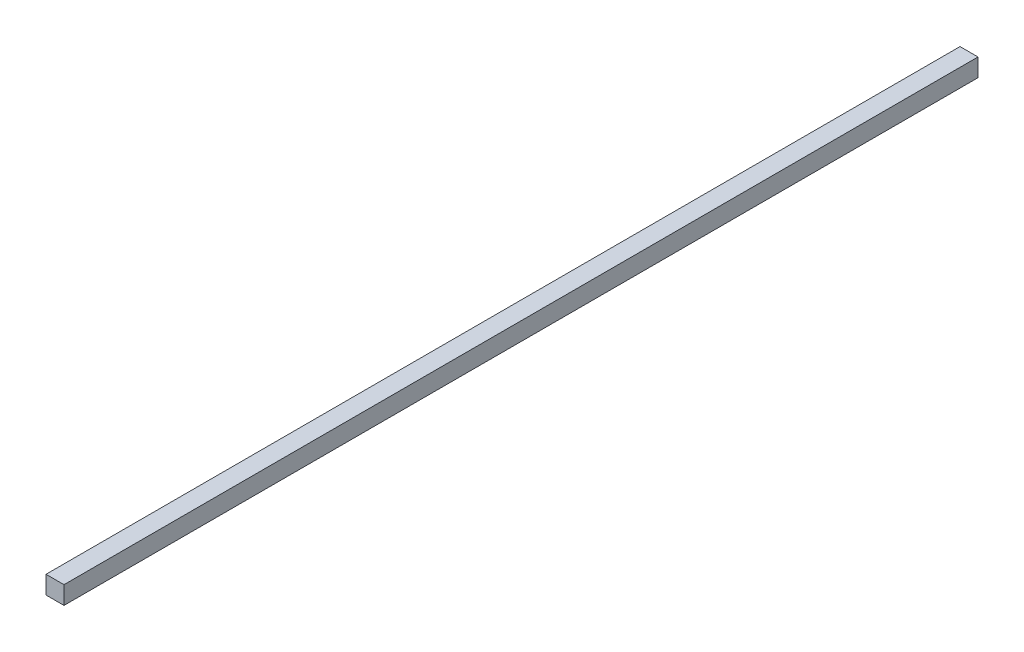
ISO-10303-21;
HEADER;
FILE_DESCRIPTION(('STEP AP214'),'2;1');
FILE_NAME('part.step','',(''),(''),'','','');
FILE_SCHEMA(('AUTOMOTIVE_DESIGN { 1 0 10303 214 1 1 1 1 }'));
ENDSEC;
DATA;
#1=APPLICATION_CONTEXT('core data for automotive mechanical design processes');
#2=APPLICATION_PROTOCOL_DEFINITION('international standard','automotive_design',2000,#1);
#3=PRODUCT_CONTEXT('',#1,'mechanical');
#4=PRODUCT('Part','Part','',(#3));
#5=PRODUCT_RELATED_PRODUCT_CATEGORY('part','',(#4));
#6=PRODUCT_DEFINITION_FORMATION('','',#4);
#7=PRODUCT_DEFINITION_CONTEXT('part definition',#1,'design');
#8=PRODUCT_DEFINITION('design','',#6,#7);
#9=PRODUCT_DEFINITION_SHAPE('','',#8);
#10=(LENGTH_UNIT() NAMED_UNIT(*) SI_UNIT(.MILLI.,.METRE.));
#11=(NAMED_UNIT(*) PLANE_ANGLE_UNIT() SI_UNIT($,.RADIAN.));
#12=(NAMED_UNIT(*) SI_UNIT($,.STERADIAN.) SOLID_ANGLE_UNIT());
#13=UNCERTAINTY_MEASURE_WITH_UNIT(LENGTH_MEASURE(1.E-05),#10,'distance_accuracy_value','');
#14=(GEOMETRIC_REPRESENTATION_CONTEXT(3) GLOBAL_UNCERTAINTY_ASSIGNED_CONTEXT((#13)) GLOBAL_UNIT_ASSIGNED_CONTEXT((#10,
#11,#12)) REPRESENTATION_CONTEXT('',''));
#15=CARTESIAN_POINT('',(0.,0.,0.));
#16=DIRECTION('',(0.,0.,1.));
#17=DIRECTION('',(1.,0.,0.));
#18=AXIS2_PLACEMENT_3D('',#15,#16,#17);
#19=CARTESIAN_POINT('',(-3.,-3.,152.4));
#20=DIRECTION('',(1.,0.,0.));
#21=DIRECTION('',(0.,1.,0.));
#22=AXIS2_PLACEMENT_3D('',#19,#20,#21);
#23=PLANE('',#22);
#24=DIRECTION('',(0.,-1.,0.));
#25=VECTOR('',#24,1.);
#26=CARTESIAN_POINT('',(-3.,-3.,-152.4));
#27=LINE('',#26,#25);
#28=CARTESIAN_POINT('',(-3.,3.,-152.4));
#29=VERTEX_POINT('',#28);
#30=CARTESIAN_POINT('',(-3.,-3.,-152.4));
#31=VERTEX_POINT('',#30);
#32=EDGE_CURVE('E97',#29,#31,#27,.T.);
#33=ORIENTED_EDGE('',*,*,#32,.T.);
#34=DIRECTION('',(0.,0.,-1.));
#35=VECTOR('',#34,1.);
#36=CARTESIAN_POINT('',(-3.,-3.,152.4));
#37=LINE('',#36,#35);
#38=CARTESIAN_POINT('',(-3.,-3.,152.4));
#39=VERTEX_POINT('',#38);
#40=EDGE_CURVE('E11',#39,#31,#37,.T.);
#41=ORIENTED_EDGE('',*,*,#40,.F.);
#42=DIRECTION('',(0.,-1.,0.));
#43=VECTOR('',#42,1.);
#44=CARTESIAN_POINT('',(-3.,-3.,152.4));
#45=LINE('',#44,#43);
#46=CARTESIAN_POINT('',(-3.,3.,152.4));
#47=VERTEX_POINT('',#46);
#48=EDGE_CURVE('E85',#47,#39,#45,.T.);
#49=ORIENTED_EDGE('',*,*,#48,.F.);
#50=DIRECTION('',(0.,0.,-1.));
#51=VECTOR('',#50,1.);
#52=CARTESIAN_POINT('',(-3.,3.,152.4));
#53=LINE('',#52,#51);
#54=EDGE_CURVE('E93',#47,#29,#53,.T.);
#55=ORIENTED_EDGE('',*,*,#54,.T.);
#56=EDGE_LOOP('',(#33,#41,#49,#55));
#57=FACE_BOUND('',#56,.T.);
#58=ADVANCED_FACE('F34',(#57),#23,.F.);
#59=CARTESIAN_POINT('',(3.,-3.,152.4));
#60=DIRECTION('',(0.,1.,0.));
#61=DIRECTION('',(-1.,0.,0.));
#62=AXIS2_PLACEMENT_3D('',#59,#60,#61);
#63=PLANE('',#62);
#64=DIRECTION('',(1.,0.,0.));
#65=VECTOR('',#64,1.);
#66=CARTESIAN_POINT('',(3.,-3.,-152.4));
#67=LINE('',#66,#65);
#68=CARTESIAN_POINT('',(3.,-3.,-152.4));
#69=VERTEX_POINT('',#68);
#70=EDGE_CURVE('E89',#31,#69,#67,.T.);
#71=ORIENTED_EDGE('',*,*,#70,.T.);
#72=DIRECTION('',(0.,0.,-1.));
#73=VECTOR('',#72,1.);
#74=CARTESIAN_POINT('',(3.,-3.,152.4));
#75=LINE('',#74,#73);
#76=CARTESIAN_POINT('',(3.,-3.,152.4));
#77=VERTEX_POINT('',#76);
#78=EDGE_CURVE('E42',#77,#69,#75,.T.);
#79=ORIENTED_EDGE('',*,*,#78,.F.);
#80=DIRECTION('',(1.,0.,0.));
#81=VECTOR('',#80,1.);
#82=CARTESIAN_POINT('',(3.,-3.,152.4));
#83=LINE('',#82,#81);
#84=EDGE_CURVE('E80',#39,#77,#83,.T.);
#85=ORIENTED_EDGE('',*,*,#84,.F.);
#86=ORIENTED_EDGE('',*,*,#40,.T.);
#87=EDGE_LOOP('',(#71,#79,#85,#86));
#88=FACE_BOUND('',#87,.T.);
#89=ADVANCED_FACE('F88',(#88),#63,.F.);
#90=CARTESIAN_POINT('',(3.,3.,152.4));
#91=DIRECTION('',(-1.,0.,0.));
#92=DIRECTION('',(0.,-1.,0.));
#93=AXIS2_PLACEMENT_3D('',#90,#91,#92);
#94=PLANE('',#93);
#95=DIRECTION('',(0.,1.,0.));
#96=VECTOR('',#95,1.);
#97=CARTESIAN_POINT('',(3.,3.,-152.4));
#98=LINE('',#97,#96);
#99=CARTESIAN_POINT('',(3.,3.,-152.4));
#100=VERTEX_POINT('',#99);
#101=EDGE_CURVE('E67',#69,#100,#98,.T.);
#102=ORIENTED_EDGE('',*,*,#101,.T.);
#103=DIRECTION('',(0.,0.,-1.));
#104=VECTOR('',#103,1.);
#105=CARTESIAN_POINT('',(3.,3.,152.4));
#106=LINE('',#105,#104);
#107=CARTESIAN_POINT('',(3.,3.,152.4));
#108=VERTEX_POINT('',#107);
#109=EDGE_CURVE('E90',#108,#100,#106,.T.);
#110=ORIENTED_EDGE('',*,*,#109,.F.);
#111=DIRECTION('',(0.,1.,0.));
#112=VECTOR('',#111,1.);
#113=CARTESIAN_POINT('',(3.,3.,152.4));
#114=LINE('',#113,#112);
#115=EDGE_CURVE('E83',#77,#108,#114,.T.);
#116=ORIENTED_EDGE('',*,*,#115,.F.);
#117=ORIENTED_EDGE('',*,*,#78,.T.);
#118=EDGE_LOOP('',(#102,#110,#116,#117));
#119=FACE_BOUND('',#118,.T.);
#120=ADVANCED_FACE('F91',(#119),#94,.F.);
#121=CARTESIAN_POINT('',(-3.,3.,152.4));
#122=DIRECTION('',(0.,-1.,0.));
#123=DIRECTION('',(1.,0.,0.));
#124=AXIS2_PLACEMENT_3D('',#121,#122,#123);
#125=PLANE('',#124);
#126=DIRECTION('',(-1.,0.,0.));
#127=VECTOR('',#126,1.);
#128=CARTESIAN_POINT('',(-3.,3.,-152.4));
#129=LINE('',#128,#127);
#130=EDGE_CURVE('E73',#100,#29,#129,.T.);
#131=ORIENTED_EDGE('',*,*,#130,.T.);
#132=ORIENTED_EDGE('',*,*,#54,.F.);
#133=DIRECTION('',(-1.,0.,0.));
#134=VECTOR('',#133,1.);
#135=CARTESIAN_POINT('',(-3.,3.,152.4));
#136=LINE('',#135,#134);
#137=EDGE_CURVE('E50',#108,#47,#136,.T.);
#138=ORIENTED_EDGE('',*,*,#137,.F.);
#139=ORIENTED_EDGE('',*,*,#109,.T.);
#140=EDGE_LOOP('',(#131,#132,#138,#139));
#141=FACE_BOUND('',#140,.T.);
#142=ADVANCED_FACE('F104',(#141),#125,.F.);
#143=CARTESIAN_POINT('',(0.,0.,152.4));
#144=DIRECTION('',(0.,0.,-1.));
#145=DIRECTION('',(-1.,0.,0.));
#146=AXIS2_PLACEMENT_3D('',#143,#144,#145);
#147=PLANE('',#146);
#148=ORIENTED_EDGE('',*,*,#48,.T.);
#149=ORIENTED_EDGE('',*,*,#84,.T.);
#150=ORIENTED_EDGE('',*,*,#115,.T.);
#151=ORIENTED_EDGE('',*,*,#137,.T.);
#152=EDGE_LOOP('',(#148,#149,#150,#151));
#153=FACE_BOUND('',#152,.T.);
#154=ADVANCED_FACE('F81',(#153),#147,.F.);
#155=CARTESIAN_POINT('',(0.,0.,-152.4));
#156=DIRECTION('',(0.,0.,-1.));
#157=DIRECTION('',(-1.,0.,0.));
#158=AXIS2_PLACEMENT_3D('',#155,#156,#157);
#159=PLANE('',#158);
#160=ORIENTED_EDGE('',*,*,#32,.F.);
#161=ORIENTED_EDGE('',*,*,#130,.F.);
#162=ORIENTED_EDGE('',*,*,#101,.F.);
#163=ORIENTED_EDGE('',*,*,#70,.F.);
#164=EDGE_LOOP('',(#160,#161,#162,#163));
#165=FACE_BOUND('',#164,.T.);
#166=ADVANCED_FACE('F107',(#165),#159,.T.);
#167=CLOSED_SHELL('',(#58,#89,#120,#142,#154,#166));
#168=MANIFOLD_SOLID_BREP('B2',#167);
#169=ADVANCED_BREP_SHAPE_REPRESENTATION('',(#18,#168),#14);
#170=SHAPE_DEFINITION_REPRESENTATION(#9,#169);
ENDSEC;
END-ISO-10303-21;
